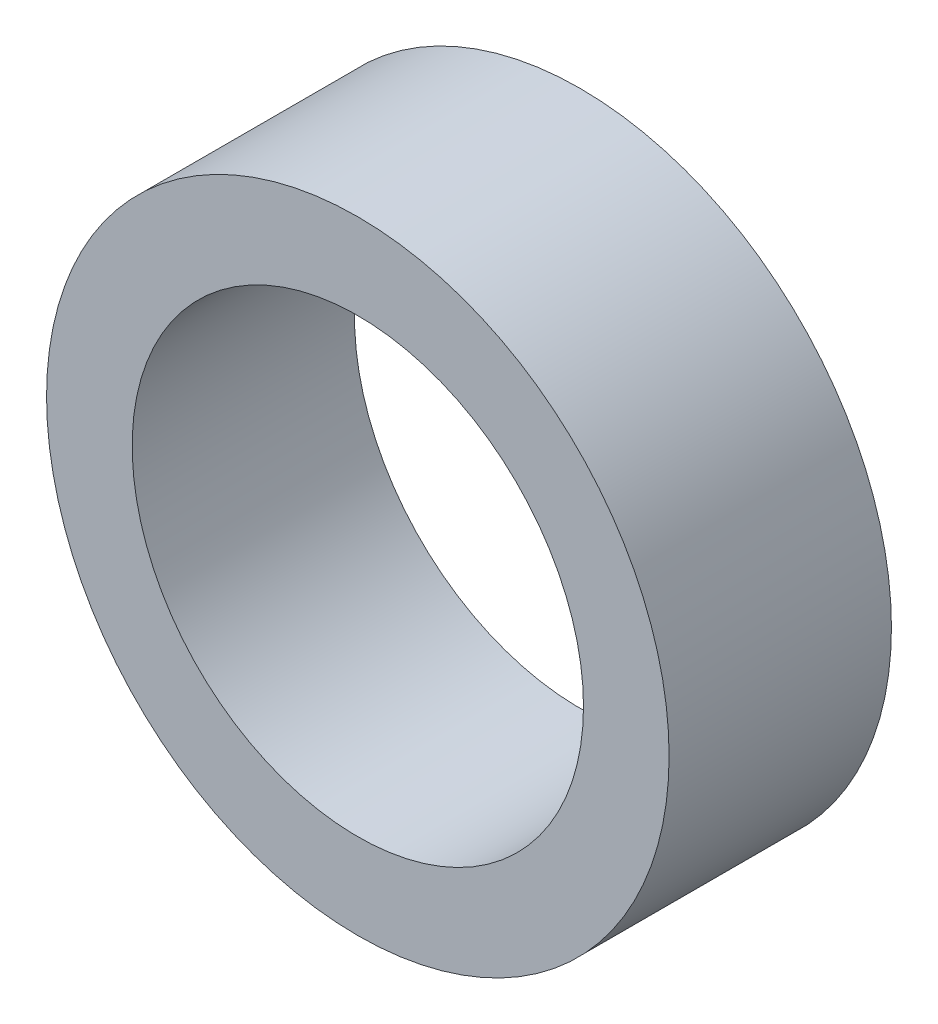
ISO-10303-21;
HEADER;
FILE_DESCRIPTION(('STEP AP214'),'2;1');
FILE_NAME('part.step','',(''),(''),'','','');
FILE_SCHEMA(('AUTOMOTIVE_DESIGN { 1 0 10303 214 1 1 1 1 }'));
ENDSEC;
DATA;
#1=APPLICATION_CONTEXT('core data for automotive mechanical design processes');
#2=APPLICATION_PROTOCOL_DEFINITION('international standard','automotive_design',2000,#1);
#3=PRODUCT_CONTEXT('',#1,'mechanical');
#4=PRODUCT('Part','Part','',(#3));
#5=PRODUCT_RELATED_PRODUCT_CATEGORY('part','',(#4));
#6=PRODUCT_DEFINITION_FORMATION('','',#4);
#7=PRODUCT_DEFINITION_CONTEXT('part definition',#1,'design');
#8=PRODUCT_DEFINITION('design','',#6,#7);
#9=PRODUCT_DEFINITION_SHAPE('','',#8);
#10=(LENGTH_UNIT() NAMED_UNIT(*) SI_UNIT(.MILLI.,.METRE.));
#11=(NAMED_UNIT(*) PLANE_ANGLE_UNIT() SI_UNIT($,.RADIAN.));
#12=(NAMED_UNIT(*) SI_UNIT($,.STERADIAN.) SOLID_ANGLE_UNIT());
#13=UNCERTAINTY_MEASURE_WITH_UNIT(LENGTH_MEASURE(1.E-05),#10,'distance_accuracy_value','');
#14=(GEOMETRIC_REPRESENTATION_CONTEXT(3) GLOBAL_UNCERTAINTY_ASSIGNED_CONTEXT((#13)) GLOBAL_UNIT_ASSIGNED_CONTEXT((#10,
#11,#12)) REPRESENTATION_CONTEXT('',''));
#15=CARTESIAN_POINT('',(0.,0.,0.));
#16=DIRECTION('',(0.,0.,1.));
#17=DIRECTION('',(1.,0.,0.));
#18=AXIS2_PLACEMENT_3D('',#15,#16,#17);
#19=CARTESIAN_POINT('',(0.,0.,5.));
#20=DIRECTION('',(0.,0.,1.));
#21=DIRECTION('',(1.,0.,0.));
#22=AXIS2_PLACEMENT_3D('',#19,#20,#21);
#23=PLANE('',#22);
#24=CARTESIAN_POINT('',(0.,0.,5.));
#25=DIRECTION('',(0.,0.,1.));
#26=DIRECTION('',(1.,0.,0.));
#27=AXIS2_PLACEMENT_3D('',#24,#25,#26);
#28=CIRCLE('',#27,7.);
#29=CARTESIAN_POINT('',(7.,0.,5.));
#30=VERTEX_POINT('',#29);
#31=EDGE_CURVE('E10',#30,#30,#28,.T.);
#32=ORIENTED_EDGE('',*,*,#31,.T.);
#33=EDGE_LOOP('',(#32));
#34=FACE_BOUND('',#33,.T.);
#35=CARTESIAN_POINT('',(0.,0.,5.));
#36=DIRECTION('',(0.,0.,1.));
#37=DIRECTION('',(1.,0.,0.));
#38=AXIS2_PLACEMENT_3D('',#35,#36,#37);
#39=CIRCLE('',#38,5.075);
#40=CARTESIAN_POINT('',(5.075,0.,5.));
#41=VERTEX_POINT('',#40);
#42=EDGE_CURVE('E48',#41,#41,#39,.T.);
#43=ORIENTED_EDGE('',*,*,#42,.F.);
#44=EDGE_LOOP('',(#43));
#45=FACE_BOUND('',#44,.T.);
#46=ADVANCED_FACE('F37',(#34,#45),#23,.T.);
#47=CARTESIAN_POINT('',(0.,0.,0.));
#48=DIRECTION('',(0.,0.,1.));
#49=DIRECTION('',(1.,0.,0.));
#50=AXIS2_PLACEMENT_3D('',#47,#48,#49);
#51=PLANE('',#50);
#52=CARTESIAN_POINT('',(0.,0.,0.));
#53=DIRECTION('',(0.,0.,1.));
#54=DIRECTION('',(1.,0.,0.));
#55=AXIS2_PLACEMENT_3D('',#52,#53,#54);
#56=CIRCLE('',#55,7.);
#57=CARTESIAN_POINT('',(7.,0.,0.));
#58=VERTEX_POINT('',#57);
#59=EDGE_CURVE('E41',#58,#58,#56,.T.);
#60=ORIENTED_EDGE('',*,*,#59,.F.);
#61=EDGE_LOOP('',(#60));
#62=FACE_BOUND('',#61,.T.);
#63=CARTESIAN_POINT('',(0.,0.,0.));
#64=DIRECTION('',(0.,0.,1.));
#65=DIRECTION('',(1.,0.,0.));
#66=AXIS2_PLACEMENT_3D('',#63,#64,#65);
#67=CIRCLE('',#66,5.075);
#68=CARTESIAN_POINT('',(5.075,0.,0.));
#69=VERTEX_POINT('',#68);
#70=EDGE_CURVE('E50',#69,#69,#67,.T.);
#71=ORIENTED_EDGE('',*,*,#70,.T.);
#72=EDGE_LOOP('',(#71));
#73=FACE_BOUND('',#72,.T.);
#74=ADVANCED_FACE('F60',(#62,#73),#51,.F.);
#75=CARTESIAN_POINT('',(0.,0.,5.));
#76=DIRECTION('',(0.,0.,-1.));
#77=DIRECTION('',(-1.,0.,0.));
#78=AXIS2_PLACEMENT_3D('',#75,#76,#77);
#79=CYLINDRICAL_SURFACE('',#78,7.);
#80=ORIENTED_EDGE('',*,*,#31,.F.);
#81=EDGE_LOOP('',(#80));
#82=FACE_BOUND('',#81,.T.);
#83=ORIENTED_EDGE('',*,*,#59,.T.);
#84=EDGE_LOOP('',(#83));
#85=FACE_BOUND('',#84,.T.);
#86=ADVANCED_FACE('F39',(#82,#85),#79,.T.);
#87=CARTESIAN_POINT('',(0.,0.,5.));
#88=DIRECTION('',(0.,0.,-1.));
#89=DIRECTION('',(-1.,0.,0.));
#90=AXIS2_PLACEMENT_3D('',#87,#88,#89);
#91=CYLINDRICAL_SURFACE('',#90,5.075);
#92=ORIENTED_EDGE('',*,*,#42,.T.);
#93=EDGE_LOOP('',(#92));
#94=FACE_BOUND('',#93,.T.);
#95=ORIENTED_EDGE('',*,*,#70,.F.);
#96=EDGE_LOOP('',(#95));
#97=FACE_BOUND('',#96,.T.);
#98=ADVANCED_FACE('F56',(#94,#97),#91,.F.);
#99=CLOSED_SHELL('',(#46,#74,#86,#98));
#100=MANIFOLD_SOLID_BREP('B2',#99);
#101=ADVANCED_BREP_SHAPE_REPRESENTATION('',(#18,#100),#14);
#102=SHAPE_DEFINITION_REPRESENTATION(#9,#101);
ENDSEC;
END-ISO-10303-21;
